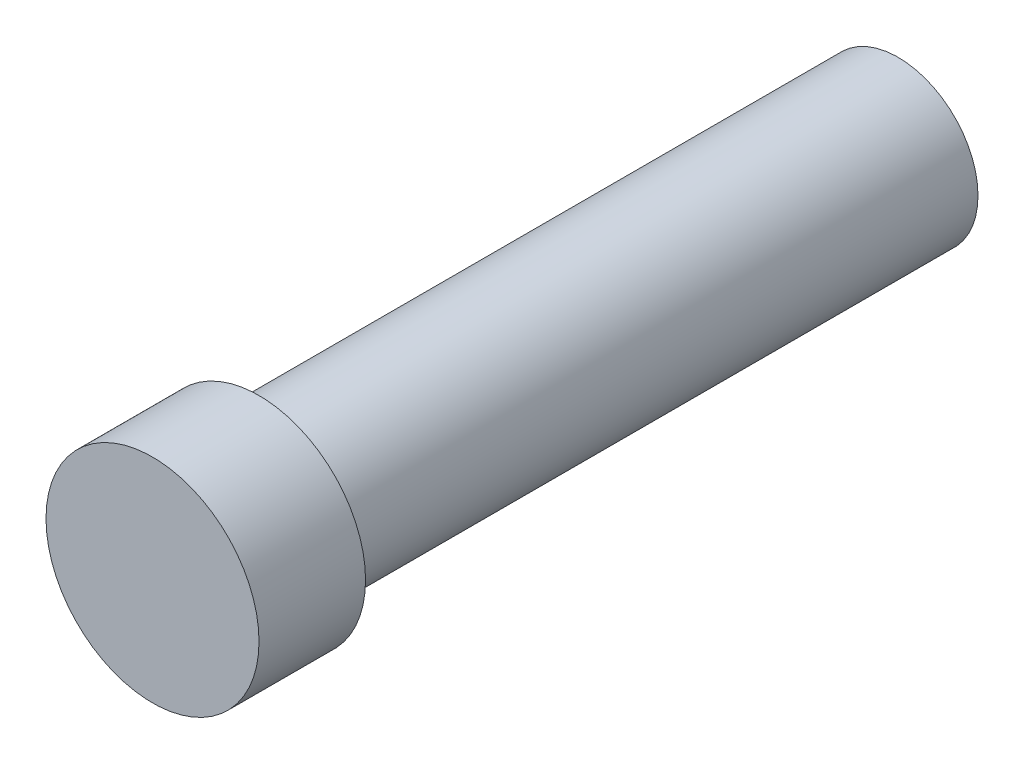
ISO-10303-21;
HEADER;
FILE_DESCRIPTION(('STEP AP214'),'2;1');
FILE_NAME('part.step','',(''),(''),'','','');
FILE_SCHEMA(('AUTOMOTIVE_DESIGN { 1 0 10303 214 1 1 1 1 }'));
ENDSEC;
DATA;
#1=APPLICATION_CONTEXT('core data for automotive mechanical design processes');
#2=APPLICATION_PROTOCOL_DEFINITION('international standard','automotive_design',2000,#1);
#3=PRODUCT_CONTEXT('',#1,'mechanical');
#4=PRODUCT('Part','Part','',(#3));
#5=PRODUCT_RELATED_PRODUCT_CATEGORY('part','',(#4));
#6=PRODUCT_DEFINITION_FORMATION('','',#4);
#7=PRODUCT_DEFINITION_CONTEXT('part definition',#1,'design');
#8=PRODUCT_DEFINITION('design','',#6,#7);
#9=PRODUCT_DEFINITION_SHAPE('','',#8);
#10=(LENGTH_UNIT() NAMED_UNIT(*) SI_UNIT(.MILLI.,.METRE.));
#11=(NAMED_UNIT(*) PLANE_ANGLE_UNIT() SI_UNIT($,.RADIAN.));
#12=(NAMED_UNIT(*) SI_UNIT($,.STERADIAN.) SOLID_ANGLE_UNIT());
#13=UNCERTAINTY_MEASURE_WITH_UNIT(LENGTH_MEASURE(1.E-05),#10,'distance_accuracy_value','');
#14=(GEOMETRIC_REPRESENTATION_CONTEXT(3) GLOBAL_UNCERTAINTY_ASSIGNED_CONTEXT((#13)) GLOBAL_UNIT_ASSIGNED_CONTEXT((#10,
#11,#12)) REPRESENTATION_CONTEXT('',''));
#15=CARTESIAN_POINT('',(0.,0.,0.));
#16=DIRECTION('',(0.,0.,1.));
#17=DIRECTION('',(1.,0.,0.));
#18=AXIS2_PLACEMENT_3D('',#15,#16,#17);
#19=CARTESIAN_POINT('',(0.,0.,12.));
#20=DIRECTION('',(0.,0.,-1.));
#21=DIRECTION('',(-1.,0.,0.));
#22=AXIS2_PLACEMENT_3D('',#19,#20,#21);
#23=CYLINDRICAL_SURFACE('',#22,1.5);
#24=CARTESIAN_POINT('',(0.,0.,12.));
#25=DIRECTION('',(0.,0.,1.));
#26=DIRECTION('',(1.,0.,0.));
#27=AXIS2_PLACEMENT_3D('',#24,#25,#26);
#28=CIRCLE('',#27,1.5);
#29=CARTESIAN_POINT('',(1.5,0.,12.));
#30=VERTEX_POINT('',#29);
#31=EDGE_CURVE('E10',#30,#30,#28,.T.);
#32=ORIENTED_EDGE('',*,*,#31,.F.);
#33=EDGE_LOOP('',(#32));
#34=FACE_BOUND('',#33,.T.);
#35=CARTESIAN_POINT('',(0.,0.,0.));
#36=DIRECTION('',(0.,0.,1.));
#37=DIRECTION('',(1.,0.,0.));
#38=AXIS2_PLACEMENT_3D('',#35,#36,#37);
#39=CIRCLE('',#38,1.5);
#40=CARTESIAN_POINT('',(1.5,0.,0.));
#41=VERTEX_POINT('',#40);
#42=EDGE_CURVE('E34',#41,#41,#39,.T.);
#43=ORIENTED_EDGE('',*,*,#42,.T.);
#44=EDGE_LOOP('',(#43));
#45=FACE_BOUND('',#44,.T.);
#46=ADVANCED_FACE('F31',(#34,#45),#23,.T.);
#47=CARTESIAN_POINT('',(0.,0.,0.));
#48=DIRECTION('',(0.,0.,1.));
#49=DIRECTION('',(1.,0.,0.));
#50=AXIS2_PLACEMENT_3D('',#47,#48,#49);
#51=PLANE('',#50);
#52=ORIENTED_EDGE('',*,*,#42,.F.);
#53=EDGE_LOOP('',(#52));
#54=FACE_BOUND('',#53,.T.);
#55=ADVANCED_FACE('F59',(#54),#51,.F.);
#56=CARTESIAN_POINT('',(0.,0.,12.));
#57=DIRECTION('',(0.,0.,1.));
#58=DIRECTION('',(1.,0.,0.));
#59=AXIS2_PLACEMENT_3D('',#56,#57,#58);
#60=PLANE('',#59);
#61=CARTESIAN_POINT('',(0.,0.,12.));
#62=DIRECTION('',(0.,0.,1.));
#63=DIRECTION('',(1.,0.,0.));
#64=AXIS2_PLACEMENT_3D('',#61,#62,#63);
#65=CIRCLE('',#64,2.);
#66=CARTESIAN_POINT('',(2.,0.,12.));
#67=VERTEX_POINT('',#66);
#68=EDGE_CURVE('E43',#67,#67,#65,.T.);
#69=ORIENTED_EDGE('',*,*,#68,.F.);
#70=EDGE_LOOP('',(#69));
#71=FACE_BOUND('',#70,.T.);
#72=ORIENTED_EDGE('',*,*,#31,.T.);
#73=EDGE_LOOP('',(#72));
#74=FACE_BOUND('',#73,.T.);
#75=ADVANCED_FACE('F54',(#71,#74),#60,.F.);
#76=CARTESIAN_POINT('',(0.,0.,14.));
#77=DIRECTION('',(0.,0.,-1.));
#78=DIRECTION('',(-1.,0.,0.));
#79=AXIS2_PLACEMENT_3D('',#76,#77,#78);
#80=CYLINDRICAL_SURFACE('',#79,2.);
#81=CARTESIAN_POINT('',(0.,0.,14.));
#82=DIRECTION('',(0.,0.,1.));
#83=DIRECTION('',(1.,0.,0.));
#84=AXIS2_PLACEMENT_3D('',#81,#82,#83);
#85=CIRCLE('',#84,2.);
#86=CARTESIAN_POINT('',(2.,0.,14.));
#87=VERTEX_POINT('',#86);
#88=EDGE_CURVE('E41',#87,#87,#85,.T.);
#89=ORIENTED_EDGE('',*,*,#88,.F.);
#90=EDGE_LOOP('',(#89));
#91=FACE_BOUND('',#90,.T.);
#92=ORIENTED_EDGE('',*,*,#68,.T.);
#93=EDGE_LOOP('',(#92));
#94=FACE_BOUND('',#93,.T.);
#95=ADVANCED_FACE('F51',(#91,#94),#80,.T.);
#96=CARTESIAN_POINT('',(0.,0.,14.));
#97=DIRECTION('',(0.,0.,1.));
#98=DIRECTION('',(1.,0.,0.));
#99=AXIS2_PLACEMENT_3D('',#96,#97,#98);
#100=PLANE('',#99);
#101=ORIENTED_EDGE('',*,*,#88,.T.);
#102=EDGE_LOOP('',(#101));
#103=FACE_BOUND('',#102,.T.);
#104=ADVANCED_FACE('F49',(#103),#100,.T.);
#105=CLOSED_SHELL('',(#46,#55,#75,#95,#104));
#106=MANIFOLD_SOLID_BREP('B2',#105);
#107=ADVANCED_BREP_SHAPE_REPRESENTATION('',(#18,#106),#14);
#108=SHAPE_DEFINITION_REPRESENTATION(#9,#107);
ENDSEC;
END-ISO-10303-21;
